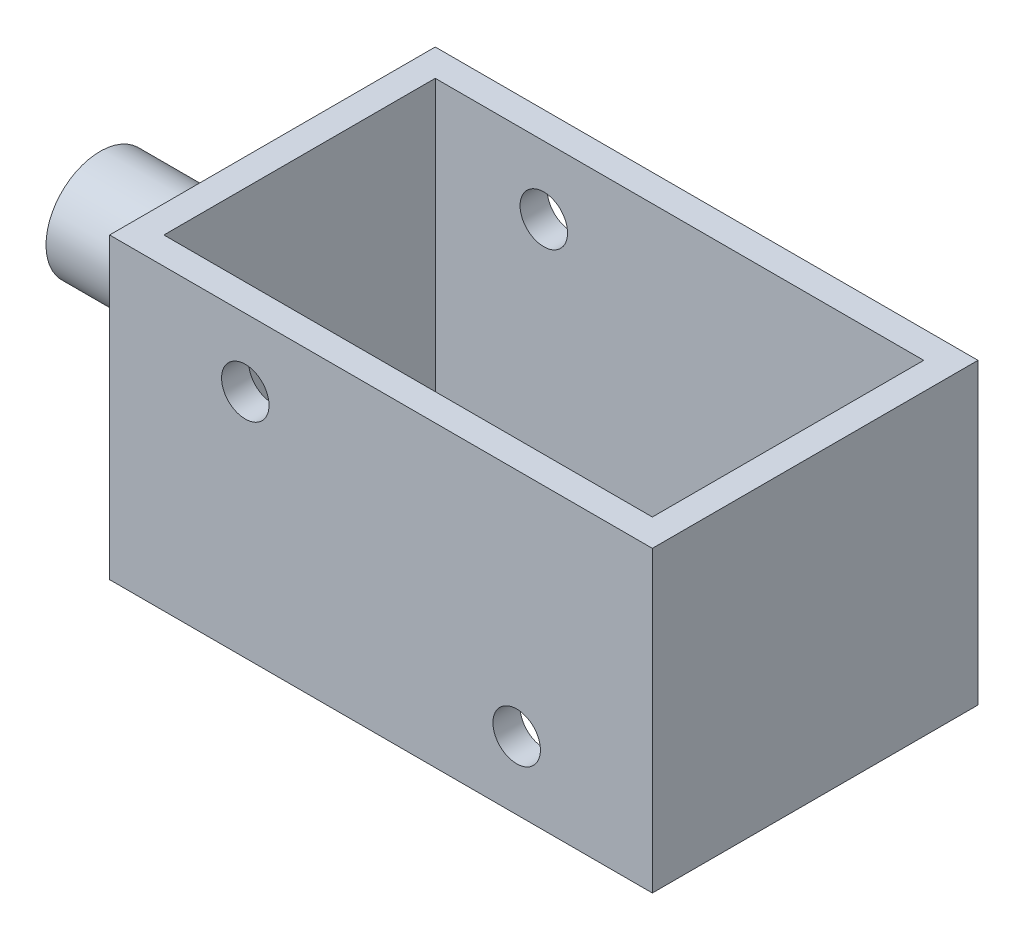
ISO-10303-21;
HEADER;
FILE_DESCRIPTION(('STEP AP214'),'2;1');
FILE_NAME('part.step','',(''),(''),'','','');
FILE_SCHEMA(('AUTOMOTIVE_DESIGN { 1 0 10303 214 1 1 1 1 }'));
ENDSEC;
DATA;
#1=APPLICATION_CONTEXT('core data for automotive mechanical design processes');
#2=APPLICATION_PROTOCOL_DEFINITION('international standard','automotive_design',2000,#1);
#3=PRODUCT_CONTEXT('',#1,'mechanical');
#4=PRODUCT('Part','Part','',(#3));
#5=PRODUCT_RELATED_PRODUCT_CATEGORY('part','',(#4));
#6=PRODUCT_DEFINITION_FORMATION('','',#4);
#7=PRODUCT_DEFINITION_CONTEXT('part definition',#1,'design');
#8=PRODUCT_DEFINITION('design','',#6,#7);
#9=PRODUCT_DEFINITION_SHAPE('','',#8);
#10=(LENGTH_UNIT() NAMED_UNIT(*) SI_UNIT(.MILLI.,.METRE.));
#11=(NAMED_UNIT(*) PLANE_ANGLE_UNIT() SI_UNIT($,.RADIAN.));
#12=(NAMED_UNIT(*) SI_UNIT($,.STERADIAN.) SOLID_ANGLE_UNIT());
#13=UNCERTAINTY_MEASURE_WITH_UNIT(LENGTH_MEASURE(1.E-05),#10,'distance_accuracy_value','');
#14=(GEOMETRIC_REPRESENTATION_CONTEXT(3) GLOBAL_UNCERTAINTY_ASSIGNED_CONTEXT((#13)) GLOBAL_UNIT_ASSIGNED_CONTEXT((#10,
#11,#12)) REPRESENTATION_CONTEXT('',''));
#15=CARTESIAN_POINT('',(0.,0.,0.));
#16=DIRECTION('',(0.,0.,1.));
#17=DIRECTION('',(1.,0.,0.));
#18=AXIS2_PLACEMENT_3D('',#15,#16,#17);
#19=CARTESIAN_POINT('',(20.,-5.5,6.));
#20=DIRECTION('',(0.,1.,0.));
#21=DIRECTION('',(0.,0.,1.));
#22=AXIS2_PLACEMENT_3D('',#19,#20,#21);
#23=PLANE('',#22);
#24=DIRECTION('',(1.,0.,0.));
#25=VECTOR('',#24,1.);
#26=CARTESIAN_POINT('',(20.,-5.5,-6.));
#27=LINE('',#26,#25);
#28=CARTESIAN_POINT('',(0.,-5.5,-6.));
#29=VERTEX_POINT('',#28);
#30=CARTESIAN_POINT('',(20.,-5.5,-6.));
#31=VERTEX_POINT('',#30);
#32=EDGE_CURVE('E129',#29,#31,#27,.T.);
#33=ORIENTED_EDGE('',*,*,#32,.T.);
#34=DIRECTION('',(0.,0.,-1.));
#35=VECTOR('',#34,1.);
#36=CARTESIAN_POINT('',(20.,-5.5,6.));
#37=LINE('',#36,#35);
#38=CARTESIAN_POINT('',(20.,-5.5,6.));
#39=VERTEX_POINT('',#38);
#40=EDGE_CURVE('E41',#39,#31,#37,.T.);
#41=ORIENTED_EDGE('',*,*,#40,.F.);
#42=DIRECTION('',(1.,0.,0.));
#43=VECTOR('',#42,1.);
#44=CARTESIAN_POINT('',(20.,-5.5,6.));
#45=LINE('',#44,#43);
#46=CARTESIAN_POINT('',(0.,-5.5,6.));
#47=VERTEX_POINT('',#46);
#48=EDGE_CURVE('E135',#47,#39,#45,.T.);
#49=ORIENTED_EDGE('',*,*,#48,.F.);
#50=DIRECTION('',(0.,0.,-1.));
#51=VECTOR('',#50,1.);
#52=CARTESIAN_POINT('',(0.,-5.5,6.));
#53=LINE('',#52,#51);
#54=EDGE_CURVE('E145',#47,#29,#53,.T.);
#55=ORIENTED_EDGE('',*,*,#54,.T.);
#56=EDGE_LOOP('',(#33,#41,#49,#55));
#57=FACE_BOUND('',#56,.T.);
#58=DIRECTION('',(1.,0.,0.));
#59=VECTOR('',#58,1.);
#60=CARTESIAN_POINT('',(0.,-5.5,-5.));
#61=LINE('',#60,#59);
#62=CARTESIAN_POINT('',(1.,-5.5,-5.));
#63=VERTEX_POINT('',#62);
#64=CARTESIAN_POINT('',(19.,-5.5,-5.));
#65=VERTEX_POINT('',#64);
#66=EDGE_CURVE('E105',#63,#65,#61,.T.);
#67=ORIENTED_EDGE('',*,*,#66,.F.);
#68=DIRECTION('',(0.,0.,-1.));
#69=VECTOR('',#68,1.);
#70=CARTESIAN_POINT('',(1.,-5.5,6.));
#71=LINE('',#70,#69);
#72=CARTESIAN_POINT('',(1.,-5.5,5.));
#73=VERTEX_POINT('',#72);
#74=EDGE_CURVE('E125',#73,#63,#71,.T.);
#75=ORIENTED_EDGE('',*,*,#74,.F.);
#76=DIRECTION('',(1.,0.,0.));
#77=VECTOR('',#76,1.);
#78=CARTESIAN_POINT('',(0.,-5.5,5.));
#79=LINE('',#78,#77);
#80=CARTESIAN_POINT('',(19.,-5.5,5.));
#81=VERTEX_POINT('',#80);
#82=EDGE_CURVE('E49',#73,#81,#79,.T.);
#83=ORIENTED_EDGE('',*,*,#82,.T.);
#84=DIRECTION('',(0.,0.,-1.));
#85=VECTOR('',#84,1.);
#86=CARTESIAN_POINT('',(19.,-5.5,6.));
#87=LINE('',#86,#85);
#88=EDGE_CURVE('E115',#81,#65,#87,.T.);
#89=ORIENTED_EDGE('',*,*,#88,.T.);
#90=EDGE_LOOP('',(#67,#75,#83,#89));
#91=FACE_BOUND('',#90,.T.);
#92=ADVANCED_FACE('F33',(#57,#91),#23,.F.);
#93=CARTESIAN_POINT('',(0.,5.5,6.));
#94=DIRECTION('',(0.,-1.,0.));
#95=DIRECTION('',(0.,0.,-1.));
#96=AXIS2_PLACEMENT_3D('',#93,#94,#95);
#97=PLANE('',#96);
#98=DIRECTION('',(-1.,0.,0.));
#99=VECTOR('',#98,1.);
#100=CARTESIAN_POINT('',(0.,5.5,-6.));
#101=LINE('',#100,#99);
#102=CARTESIAN_POINT('',(20.,5.5,-6.));
#103=VERTEX_POINT('',#102);
#104=CARTESIAN_POINT('',(0.,5.5,-6.));
#105=VERTEX_POINT('',#104);
#106=EDGE_CURVE('E150',#103,#105,#101,.T.);
#107=ORIENTED_EDGE('',*,*,#106,.T.);
#108=DIRECTION('',(0.,0.,-1.));
#109=VECTOR('',#108,1.);
#110=CARTESIAN_POINT('',(0.,5.5,6.));
#111=LINE('',#110,#109);
#112=CARTESIAN_POINT('',(0.,5.5,6.));
#113=VERTEX_POINT('',#112);
#114=EDGE_CURVE('E155',#113,#105,#111,.T.);
#115=ORIENTED_EDGE('',*,*,#114,.F.);
#116=DIRECTION('',(-1.,0.,0.));
#117=VECTOR('',#116,1.);
#118=CARTESIAN_POINT('',(0.,5.5,6.));
#119=LINE('',#118,#117);
#120=CARTESIAN_POINT('',(20.,5.5,6.));
#121=VERTEX_POINT('',#120);
#122=EDGE_CURVE('E141',#121,#113,#119,.T.);
#123=ORIENTED_EDGE('',*,*,#122,.F.);
#124=DIRECTION('',(0.,0.,-1.));
#125=VECTOR('',#124,1.);
#126=CARTESIAN_POINT('',(20.,5.5,6.));
#127=LINE('',#126,#125);
#128=EDGE_CURVE('E158',#121,#103,#127,.T.);
#129=ORIENTED_EDGE('',*,*,#128,.T.);
#130=EDGE_LOOP('',(#107,#115,#123,#129));
#131=FACE_BOUND('',#130,.T.);
#132=DIRECTION('',(-1.,0.,0.));
#133=VECTOR('',#132,1.);
#134=CARTESIAN_POINT('',(0.,5.5,-5.));
#135=LINE('',#134,#133);
#136=CARTESIAN_POINT('',(19.,5.5,-5.));
#137=VERTEX_POINT('',#136);
#138=CARTESIAN_POINT('',(1.,5.5,-5.));
#139=VERTEX_POINT('',#138);
#140=EDGE_CURVE('E102',#137,#139,#135,.T.);
#141=ORIENTED_EDGE('',*,*,#140,.F.);
#142=DIRECTION('',(0.,0.,-1.));
#143=VECTOR('',#142,1.);
#144=CARTESIAN_POINT('',(19.,5.5,6.));
#145=LINE('',#144,#143);
#146=CARTESIAN_POINT('',(19.,5.5,5.));
#147=VERTEX_POINT('',#146);
#148=EDGE_CURVE('E111',#147,#137,#145,.T.);
#149=ORIENTED_EDGE('',*,*,#148,.F.);
#150=DIRECTION('',(-1.,0.,0.));
#151=VECTOR('',#150,1.);
#152=CARTESIAN_POINT('',(0.,5.5,5.));
#153=LINE('',#152,#151);
#154=CARTESIAN_POINT('',(1.,5.5,5.));
#155=VERTEX_POINT('',#154);
#156=EDGE_CURVE('E54',#147,#155,#153,.T.);
#157=ORIENTED_EDGE('',*,*,#156,.T.);
#158=DIRECTION('',(0.,0.,-1.));
#159=VECTOR('',#158,1.);
#160=CARTESIAN_POINT('',(1.,5.5,6.));
#161=LINE('',#160,#159);
#162=EDGE_CURVE('E116',#155,#139,#161,.T.);
#163=ORIENTED_EDGE('',*,*,#162,.T.);
#164=EDGE_LOOP('',(#141,#149,#157,#163));
#165=FACE_BOUND('',#164,.T.);
#166=ADVANCED_FACE('F119',(#131,#165),#97,.F.);
#167=CARTESIAN_POINT('',(20.,5.5,6.));
#168=DIRECTION('',(-1.,0.,0.));
#169=DIRECTION('',(0.,0.,1.));
#170=AXIS2_PLACEMENT_3D('',#167,#168,#169);
#171=PLANE('',#170);
#172=DIRECTION('',(0.,1.,0.));
#173=VECTOR('',#172,1.);
#174=CARTESIAN_POINT('',(20.,5.5,-6.));
#175=LINE('',#174,#173);
#176=EDGE_CURVE('E148',#31,#103,#175,.T.);
#177=ORIENTED_EDGE('',*,*,#176,.T.);
#178=ORIENTED_EDGE('',*,*,#128,.F.);
#179=DIRECTION('',(0.,1.,0.));
#180=VECTOR('',#179,1.);
#181=CARTESIAN_POINT('',(20.,5.5,6.));
#182=LINE('',#181,#180);
#183=EDGE_CURVE('E138',#39,#121,#182,.T.);
#184=ORIENTED_EDGE('',*,*,#183,.F.);
#185=ORIENTED_EDGE('',*,*,#40,.T.);
#186=EDGE_LOOP('',(#177,#178,#184,#185));
#187=FACE_BOUND('',#186,.T.);
#188=ADVANCED_FACE('F199',(#187),#171,.F.);
#189=CARTESIAN_POINT('',(0.,-5.5,6.));
#190=DIRECTION('',(1.,0.,0.));
#191=DIRECTION('',(0.,0.,-1.));
#192=AXIS2_PLACEMENT_3D('',#189,#190,#191);
#193=PLANE('',#192);
#194=CARTESIAN_POINT('',(0.,0.,0.));
#195=DIRECTION('',(-1.,0.,0.));
#196=DIRECTION('',(0.,0.,1.));
#197=AXIS2_PLACEMENT_3D('',#194,#195,#196);
#198=CIRCLE('',#197,1.9939);
#199=CARTESIAN_POINT('',(0.,0.,1.9939));
#200=VERTEX_POINT('',#199);
#201=EDGE_CURVE('E11',#200,#200,#198,.T.);
#202=ORIENTED_EDGE('',*,*,#201,.F.);
#203=EDGE_LOOP('',(#202));
#204=FACE_BOUND('',#203,.T.);
#205=DIRECTION('',(0.,-1.,0.));
#206=VECTOR('',#205,1.);
#207=CARTESIAN_POINT('',(0.,-5.5,-6.));
#208=LINE('',#207,#206);
#209=EDGE_CURVE('E139',#105,#29,#208,.T.);
#210=ORIENTED_EDGE('',*,*,#209,.T.);
#211=ORIENTED_EDGE('',*,*,#54,.F.);
#212=DIRECTION('',(0.,-1.,0.));
#213=VECTOR('',#212,1.);
#214=CARTESIAN_POINT('',(0.,-5.5,6.));
#215=LINE('',#214,#213);
#216=EDGE_CURVE('E143',#113,#47,#215,.T.);
#217=ORIENTED_EDGE('',*,*,#216,.F.);
#218=ORIENTED_EDGE('',*,*,#114,.T.);
#219=EDGE_LOOP('',(#210,#211,#217,#218));
#220=FACE_BOUND('',#219,.T.);
#221=ADVANCED_FACE('F218',(#204,#220),#193,.F.);
#222=CARTESIAN_POINT('',(0.,0.,6.));
#223=DIRECTION('',(0.,0.,-1.));
#224=DIRECTION('',(-1.,0.,0.));
#225=AXIS2_PLACEMENT_3D('',#222,#223,#224);
#226=PLANE('',#225);
#227=CARTESIAN_POINT('',(5.,3.,6.));
#228=DIRECTION('',(0.,0.,1.));
#229=DIRECTION('',(1.,0.,0.));
#230=AXIS2_PLACEMENT_3D('',#227,#228,#229);
#231=CIRCLE('',#230,0.875);
#232=CARTESIAN_POINT('',(5.875,3.,6.));
#233=VERTEX_POINT('',#232);
#234=EDGE_CURVE('E171',#233,#233,#231,.T.);
#235=ORIENTED_EDGE('',*,*,#234,.F.);
#236=EDGE_LOOP('',(#235));
#237=FACE_BOUND('',#236,.T.);
#238=CARTESIAN_POINT('',(15.,-3.,6.));
#239=DIRECTION('',(0.,0.,1.));
#240=DIRECTION('',(1.,0.,0.));
#241=AXIS2_PLACEMENT_3D('',#238,#239,#240);
#242=CIRCLE('',#241,0.875000000000002);
#243=CARTESIAN_POINT('',(15.875,-3.,6.));
#244=VERTEX_POINT('',#243);
#245=EDGE_CURVE('E181',#244,#244,#242,.T.);
#246=ORIENTED_EDGE('',*,*,#245,.F.);
#247=EDGE_LOOP('',(#246));
#248=FACE_BOUND('',#247,.T.);
#249=ORIENTED_EDGE('',*,*,#48,.T.);
#250=ORIENTED_EDGE('',*,*,#183,.T.);
#251=ORIENTED_EDGE('',*,*,#122,.T.);
#252=ORIENTED_EDGE('',*,*,#216,.T.);
#253=EDGE_LOOP('',(#249,#250,#251,#252));
#254=FACE_BOUND('',#253,.T.);
#255=ADVANCED_FACE('F214',(#237,#248,#254),#226,.F.);
#256=CARTESIAN_POINT('',(0.,0.,-6.));
#257=DIRECTION('',(0.,0.,-1.));
#258=DIRECTION('',(-1.,0.,0.));
#259=AXIS2_PLACEMENT_3D('',#256,#257,#258);
#260=PLANE('',#259);
#261=CARTESIAN_POINT('',(5.,3.,-6.));
#262=DIRECTION('',(0.,0.,1.));
#263=DIRECTION('',(1.,0.,0.));
#264=AXIS2_PLACEMENT_3D('',#261,#262,#263);
#265=CIRCLE('',#264,0.875);
#266=CARTESIAN_POINT('',(5.875,3.,-6.));
#267=VERTEX_POINT('',#266);
#268=EDGE_CURVE('E165',#267,#267,#265,.T.);
#269=ORIENTED_EDGE('',*,*,#268,.T.);
#270=EDGE_LOOP('',(#269));
#271=FACE_BOUND('',#270,.T.);
#272=CARTESIAN_POINT('',(15.,-3.,-6.));
#273=DIRECTION('',(0.,0.,1.));
#274=DIRECTION('',(1.,0.,0.));
#275=AXIS2_PLACEMENT_3D('',#272,#273,#274);
#276=CIRCLE('',#275,0.875000000000002);
#277=CARTESIAN_POINT('',(15.875,-3.,-6.));
#278=VERTEX_POINT('',#277);
#279=EDGE_CURVE('E176',#278,#278,#276,.T.);
#280=ORIENTED_EDGE('',*,*,#279,.T.);
#281=EDGE_LOOP('',(#280));
#282=FACE_BOUND('',#281,.T.);
#283=ORIENTED_EDGE('',*,*,#32,.F.);
#284=ORIENTED_EDGE('',*,*,#209,.F.);
#285=ORIENTED_EDGE('',*,*,#106,.F.);
#286=ORIENTED_EDGE('',*,*,#176,.F.);
#287=EDGE_LOOP('',(#283,#284,#285,#286));
#288=FACE_BOUND('',#287,.T.);
#289=ADVANCED_FACE('F208',(#271,#282,#288),#260,.T.);
#290=CARTESIAN_POINT('',(19.,5.5,6.));
#291=DIRECTION('',(-1.,0.,0.));
#292=DIRECTION('',(0.,0.,1.));
#293=AXIS2_PLACEMENT_3D('',#290,#291,#292);
#294=PLANE('',#293);
#295=DIRECTION('',(0.,1.,0.));
#296=VECTOR('',#295,1.);
#297=CARTESIAN_POINT('',(19.,0.,-5.));
#298=LINE('',#297,#296);
#299=EDGE_CURVE('E98',#65,#137,#298,.T.);
#300=ORIENTED_EDGE('',*,*,#299,.F.);
#301=ORIENTED_EDGE('',*,*,#88,.F.);
#302=DIRECTION('',(0.,1.,0.));
#303=VECTOR('',#302,1.);
#304=CARTESIAN_POINT('',(19.,0.,5.));
#305=LINE('',#304,#303);
#306=EDGE_CURVE('E113',#81,#147,#305,.T.);
#307=ORIENTED_EDGE('',*,*,#306,.T.);
#308=ORIENTED_EDGE('',*,*,#148,.T.);
#309=EDGE_LOOP('',(#300,#301,#307,#308));
#310=FACE_BOUND('',#309,.T.);
#311=ADVANCED_FACE('F112',(#310),#294,.T.);
#312=CARTESIAN_POINT('',(1.,-5.5,6.));
#313=DIRECTION('',(1.,0.,0.));
#314=DIRECTION('',(0.,0.,-1.));
#315=AXIS2_PLACEMENT_3D('',#312,#313,#314);
#316=PLANE('',#315);
#317=DIRECTION('',(0.,-1.,0.));
#318=VECTOR('',#317,1.);
#319=CARTESIAN_POINT('',(1.,0.,-5.));
#320=LINE('',#319,#318);
#321=EDGE_CURVE('E120',#139,#63,#320,.T.);
#322=ORIENTED_EDGE('',*,*,#321,.F.);
#323=ORIENTED_EDGE('',*,*,#162,.F.);
#324=DIRECTION('',(0.,-1.,0.));
#325=VECTOR('',#324,1.);
#326=CARTESIAN_POINT('',(1.,0.,5.));
#327=LINE('',#326,#325);
#328=EDGE_CURVE('E127',#155,#73,#327,.T.);
#329=ORIENTED_EDGE('',*,*,#328,.T.);
#330=ORIENTED_EDGE('',*,*,#74,.T.);
#331=EDGE_LOOP('',(#322,#323,#329,#330));
#332=FACE_BOUND('',#331,.T.);
#333=ADVANCED_FACE('F192',(#332),#316,.T.);
#334=CARTESIAN_POINT('',(0.,0.,5.));
#335=DIRECTION('',(0.,0.,-1.));
#336=DIRECTION('',(-1.,0.,0.));
#337=AXIS2_PLACEMENT_3D('',#334,#335,#336);
#338=PLANE('',#337);
#339=CARTESIAN_POINT('',(5.,3.,5.));
#340=DIRECTION('',(0.,0.,-1.));
#341=DIRECTION('',(-1.,0.,0.));
#342=AXIS2_PLACEMENT_3D('',#339,#340,#341);
#343=CIRCLE('',#342,0.875);
#344=CARTESIAN_POINT('',(4.125,3.,5.));
#345=VERTEX_POINT('',#344);
#346=EDGE_CURVE('E184',#345,#345,#343,.T.);
#347=ORIENTED_EDGE('',*,*,#346,.F.);
#348=EDGE_LOOP('',(#347));
#349=FACE_BOUND('',#348,.T.);
#350=CARTESIAN_POINT('',(15.,-3.,5.));
#351=DIRECTION('',(0.,0.,-1.));
#352=DIRECTION('',(-1.,0.,0.));
#353=AXIS2_PLACEMENT_3D('',#350,#351,#352);
#354=CIRCLE('',#353,0.875000000000002);
#355=CARTESIAN_POINT('',(14.125,-3.,5.));
#356=VERTEX_POINT('',#355);
#357=EDGE_CURVE('E164',#356,#356,#354,.T.);
#358=ORIENTED_EDGE('',*,*,#357,.F.);
#359=EDGE_LOOP('',(#358));
#360=FACE_BOUND('',#359,.T.);
#361=ORIENTED_EDGE('',*,*,#82,.F.);
#362=ORIENTED_EDGE('',*,*,#328,.F.);
#363=ORIENTED_EDGE('',*,*,#156,.F.);
#364=ORIENTED_EDGE('',*,*,#306,.F.);
#365=EDGE_LOOP('',(#361,#362,#363,#364));
#366=FACE_BOUND('',#365,.T.);
#367=ADVANCED_FACE('F235',(#349,#360,#366),#338,.T.);
#368=CARTESIAN_POINT('',(0.,0.,-5.));
#369=DIRECTION('',(0.,0.,-1.));
#370=DIRECTION('',(-1.,0.,0.));
#371=AXIS2_PLACEMENT_3D('',#368,#369,#370);
#372=PLANE('',#371);
#373=CARTESIAN_POINT('',(5.,3.,-5.));
#374=DIRECTION('',(0.,0.,-1.));
#375=DIRECTION('',(-1.,0.,0.));
#376=AXIS2_PLACEMENT_3D('',#373,#374,#375);
#377=CIRCLE('',#376,0.875);
#378=CARTESIAN_POINT('',(4.125,3.,-5.));
#379=VERTEX_POINT('',#378);
#380=EDGE_CURVE('E36',#379,#379,#377,.T.);
#381=ORIENTED_EDGE('',*,*,#380,.T.);
#382=EDGE_LOOP('',(#381));
#383=FACE_BOUND('',#382,.T.);
#384=CARTESIAN_POINT('',(15.,-3.,-5.));
#385=DIRECTION('',(0.,0.,-1.));
#386=DIRECTION('',(-1.,0.,0.));
#387=AXIS2_PLACEMENT_3D('',#384,#385,#386);
#388=CIRCLE('',#387,0.875000000000002);
#389=CARTESIAN_POINT('',(14.125,-3.,-5.));
#390=VERTEX_POINT('',#389);
#391=EDGE_CURVE('E162',#390,#390,#388,.T.);
#392=ORIENTED_EDGE('',*,*,#391,.T.);
#393=EDGE_LOOP('',(#392));
#394=FACE_BOUND('',#393,.T.);
#395=ORIENTED_EDGE('',*,*,#66,.T.);
#396=ORIENTED_EDGE('',*,*,#299,.T.);
#397=ORIENTED_EDGE('',*,*,#140,.T.);
#398=ORIENTED_EDGE('',*,*,#321,.T.);
#399=EDGE_LOOP('',(#395,#396,#397,#398));
#400=FACE_BOUND('',#399,.T.);
#401=ADVANCED_FACE('F100',(#383,#394,#400),#372,.F.);
#402=CARTESIAN_POINT('',(-6.35,0.,0.));
#403=DIRECTION('',(1.,0.,0.));
#404=DIRECTION('',(0.,0.,-1.));
#405=AXIS2_PLACEMENT_3D('',#402,#403,#404);
#406=CYLINDRICAL_SURFACE('',#405,1.9939);
#407=CARTESIAN_POINT('',(-6.35,0.,0.));
#408=DIRECTION('',(-1.,0.,0.));
#409=DIRECTION('',(0.,0.,1.));
#410=AXIS2_PLACEMENT_3D('',#407,#408,#409);
#411=CIRCLE('',#410,1.9939);
#412=CARTESIAN_POINT('',(-6.35,0.,1.9939));
#413=VERTEX_POINT('',#412);
#414=EDGE_CURVE('E134',#413,#413,#411,.T.);
#415=ORIENTED_EDGE('',*,*,#414,.F.);
#416=EDGE_LOOP('',(#415));
#417=FACE_BOUND('',#416,.T.);
#418=ORIENTED_EDGE('',*,*,#201,.T.);
#419=EDGE_LOOP('',(#418));
#420=FACE_BOUND('',#419,.T.);
#421=ADVANCED_FACE('F234',(#417,#420),#406,.T.);
#422=CARTESIAN_POINT('',(-6.35,0.,0.));
#423=DIRECTION('',(-1.,0.,0.));
#424=DIRECTION('',(0.,0.,1.));
#425=AXIS2_PLACEMENT_3D('',#422,#423,#424);
#426=PLANE('',#425);
#427=ORIENTED_EDGE('',*,*,#414,.T.);
#428=EDGE_LOOP('',(#427));
#429=FACE_BOUND('',#428,.T.);
#430=ADVANCED_FACE('F246',(#429),#426,.T.);
#431=CARTESIAN_POINT('',(15.,-3.,-6.));
#432=DIRECTION('',(0.,0.,1.));
#433=DIRECTION('',(1.,0.,0.));
#434=AXIS2_PLACEMENT_3D('',#431,#432,#433);
#435=CYLINDRICAL_SURFACE('',#434,0.875000000000002);
#436=ORIENTED_EDGE('',*,*,#279,.F.);
#437=EDGE_LOOP('',(#436));
#438=FACE_BOUND('',#437,.T.);
#439=ORIENTED_EDGE('',*,*,#391,.F.);
#440=EDGE_LOOP('',(#439));
#441=FACE_BOUND('',#440,.T.);
#442=ADVANCED_FACE('F250',(#438,#441),#435,.F.);
#443=CARTESIAN_POINT('',(5.,3.,-6.));
#444=DIRECTION('',(0.,0.,1.));
#445=DIRECTION('',(1.,0.,0.));
#446=AXIS2_PLACEMENT_3D('',#443,#444,#445);
#447=CYLINDRICAL_SURFACE('',#446,0.875);
#448=ORIENTED_EDGE('',*,*,#268,.F.);
#449=EDGE_LOOP('',(#448));
#450=FACE_BOUND('',#449,.T.);
#451=ORIENTED_EDGE('',*,*,#380,.F.);
#452=EDGE_LOOP('',(#451));
#453=FACE_BOUND('',#452,.T.);
#454=ADVANCED_FACE('F256',(#450,#453),#447,.F.);
#455=ORIENTED_EDGE('',*,*,#357,.T.);
#456=EDGE_LOOP('',(#455));
#457=FACE_BOUND('',#456,.T.);
#458=ORIENTED_EDGE('',*,*,#245,.T.);
#459=EDGE_LOOP('',(#458));
#460=FACE_BOUND('',#459,.T.);
#461=ADVANCED_FACE('F252',(#457,#460),#435,.F.);
#462=ORIENTED_EDGE('',*,*,#346,.T.);
#463=EDGE_LOOP('',(#462));
#464=FACE_BOUND('',#463,.T.);
#465=ORIENTED_EDGE('',*,*,#234,.T.);
#466=EDGE_LOOP('',(#465));
#467=FACE_BOUND('',#466,.T.);
#468=ADVANCED_FACE('F255',(#464,#467),#447,.F.);
#469=CLOSED_SHELL('',(#92,#166,#188,#221,#255,#289,#311,#333,#367,#401,#421,#430,#442,#454,#461,#468));
#470=MANIFOLD_SOLID_BREP('B2',#469);
#471=ADVANCED_BREP_SHAPE_REPRESENTATION('',(#18,#470),#14);
#472=SHAPE_DEFINITION_REPRESENTATION(#9,#471);
ENDSEC;
END-ISO-10303-21;
